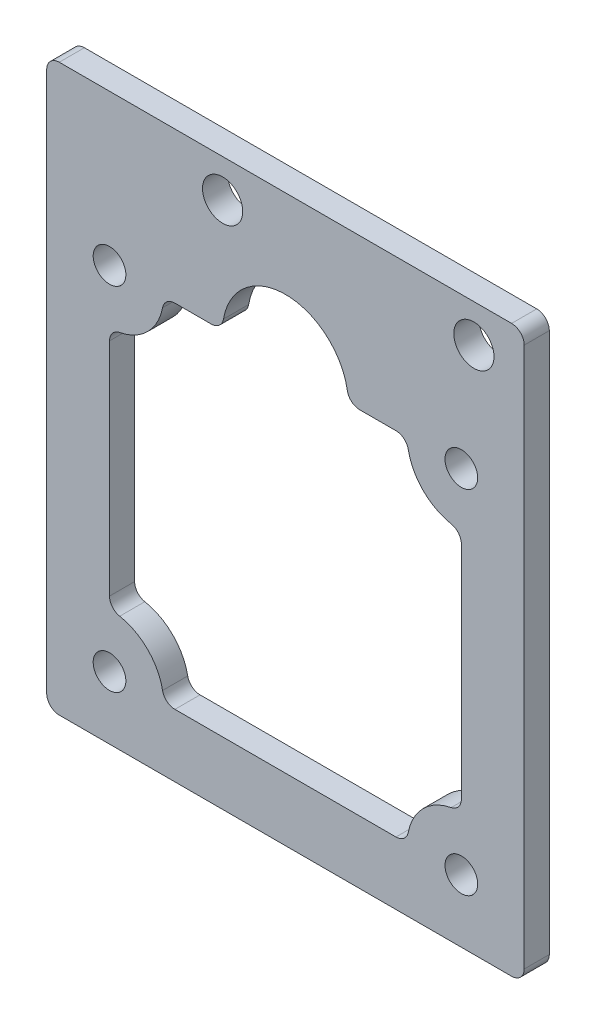
ISO-10303-21;
HEADER;
FILE_DESCRIPTION(('STEP AP214'),'2;1');
FILE_NAME('part.step','',(''),(''),'','','');
FILE_SCHEMA(('AUTOMOTIVE_DESIGN { 1 0 10303 214 1 1 1 1 }'));
ENDSEC;
DATA;
#1=APPLICATION_CONTEXT('core data for automotive mechanical design processes');
#2=APPLICATION_PROTOCOL_DEFINITION('international standard','automotive_design',2000,#1);
#3=PRODUCT_CONTEXT('',#1,'mechanical');
#4=PRODUCT('Part','Part','',(#3));
#5=PRODUCT_RELATED_PRODUCT_CATEGORY('part','',(#4));
#6=PRODUCT_DEFINITION_FORMATION('','',#4);
#7=PRODUCT_DEFINITION_CONTEXT('part definition',#1,'design');
#8=PRODUCT_DEFINITION('design','',#6,#7);
#9=PRODUCT_DEFINITION_SHAPE('','',#8);
#10=(LENGTH_UNIT() NAMED_UNIT(*) SI_UNIT(.MILLI.,.METRE.));
#11=(NAMED_UNIT(*) PLANE_ANGLE_UNIT() SI_UNIT($,.RADIAN.));
#12=(NAMED_UNIT(*) SI_UNIT($,.STERADIAN.) SOLID_ANGLE_UNIT());
#13=UNCERTAINTY_MEASURE_WITH_UNIT(LENGTH_MEASURE(1.E-05),#10,'distance_accuracy_value','');
#14=(GEOMETRIC_REPRESENTATION_CONTEXT(3) GLOBAL_UNCERTAINTY_ASSIGNED_CONTEXT((#13)) GLOBAL_UNIT_ASSIGNED_CONTEXT((#10,
#11,#12)) REPRESENTATION_CONTEXT('',''));
#15=CARTESIAN_POINT('',(0.,0.,0.));
#16=DIRECTION('',(0.,0.,1.));
#17=DIRECTION('',(1.,0.,0.));
#18=AXIS2_PLACEMENT_3D('',#15,#16,#17);
#19=CARTESIAN_POINT('',(0.,14.,2.));
#20=DIRECTION('',(0.,1.,0.));
#21=DIRECTION('',(0.,0.,1.));
#22=AXIS2_PLACEMENT_3D('',#19,#20,#21);
#23=PLANE('',#22);
#24=DIRECTION('',(1.,0.,0.));
#25=VECTOR('',#24,1.);
#26=CARTESIAN_POINT('',(0.,14.,2.));
#27=LINE('',#26,#25);
#28=CARTESIAN_POINT('',(-8.79519452813076,14.,2.));
#29=VERTEX_POINT('',#28);
#30=CARTESIAN_POINT('',(-5.91607978309962,14.,2.));
#31=VERTEX_POINT('',#30);
#32=EDGE_CURVE('E389',#29,#31,#27,.T.);
#33=ORIENTED_EDGE('',*,*,#32,.F.);
#34=DIRECTION('',(0.,0.,1.));
#35=VECTOR('',#34,1.);
#36=CARTESIAN_POINT('',(-8.79519452813076,14.,0.));
#37=LINE('',#36,#35);
#38=CARTESIAN_POINT('',(-8.79519452813076,14.,0.));
#39=VERTEX_POINT('',#38);
#40=EDGE_CURVE('E328',#29,#39,#37,.F.);
#41=ORIENTED_EDGE('',*,*,#40,.T.);
#42=DIRECTION('',(1.,0.,0.));
#43=VECTOR('',#42,1.);
#44=CARTESIAN_POINT('',(0.,14.,0.));
#45=LINE('',#44,#43);
#46=CARTESIAN_POINT('',(-5.91607978309962,14.,0.));
#47=VERTEX_POINT('',#46);
#48=EDGE_CURVE('E370',#39,#47,#45,.T.);
#49=ORIENTED_EDGE('',*,*,#48,.T.);
#50=DIRECTION('',(0.,0.,1.));
#51=VECTOR('',#50,1.);
#52=CARTESIAN_POINT('',(-5.91607978309962,14.,2.));
#53=LINE('',#52,#51);
#54=EDGE_CURVE('E325',#47,#31,#53,.T.);
#55=ORIENTED_EDGE('',*,*,#54,.T.);
#56=EDGE_LOOP('',(#33,#41,#49,#55));
#57=FACE_BOUND('',#56,.T.);
#58=ADVANCED_FACE('F37',(#57),#23,.F.);
#59=CARTESIAN_POINT('',(19.,0.,2.));
#60=DIRECTION('',(1.,0.,0.));
#61=DIRECTION('',(0.,1.,0.));
#62=AXIS2_PLACEMENT_3D('',#59,#60,#61);
#63=PLANE('',#62);
#64=DIRECTION('',(0.,-1.,0.));
#65=VECTOR('',#64,1.);
#66=CARTESIAN_POINT('',(19.,0.,0.));
#67=LINE('',#66,#65);
#68=CARTESIAN_POINT('',(19.,25.,0.));
#69=VERTEX_POINT('',#68);
#70=CARTESIAN_POINT('',(19.,-18.,0.));
#71=VERTEX_POINT('',#70);
#72=EDGE_CURVE('E226',#69,#71,#67,.T.);
#73=ORIENTED_EDGE('',*,*,#72,.F.);
#74=DIRECTION('',(0.,0.,1.));
#75=VECTOR('',#74,1.);
#76=CARTESIAN_POINT('',(19.,25.,2.));
#77=LINE('',#76,#75);
#78=CARTESIAN_POINT('',(19.,25.,2.));
#79=VERTEX_POINT('',#78);
#80=EDGE_CURVE('E239',#69,#79,#77,.T.);
#81=ORIENTED_EDGE('',*,*,#80,.T.);
#82=DIRECTION('',(0.,-1.,0.));
#83=VECTOR('',#82,1.);
#84=CARTESIAN_POINT('',(19.,0.,2.));
#85=LINE('',#84,#83);
#86=CARTESIAN_POINT('',(19.,-18.,2.));
#87=VERTEX_POINT('',#86);
#88=EDGE_CURVE('E426',#79,#87,#85,.T.);
#89=ORIENTED_EDGE('',*,*,#88,.T.);
#90=DIRECTION('',(0.,0.,-1.));
#91=VECTOR('',#90,1.);
#92=CARTESIAN_POINT('',(19.,-18.,0.));
#93=LINE('',#92,#91);
#94=EDGE_CURVE('E242',#87,#71,#93,.T.);
#95=ORIENTED_EDGE('',*,*,#94,.T.);
#96=EDGE_LOOP('',(#73,#81,#89,#95));
#97=FACE_BOUND('',#96,.T.);
#98=ADVANCED_FACE('F237',(#97),#63,.T.);
#99=CARTESIAN_POINT('',(-19.,0.,2.));
#100=DIRECTION('',(1.,0.,0.));
#101=DIRECTION('',(0.,0.,-1.));
#102=AXIS2_PLACEMENT_3D('',#99,#100,#101);
#103=PLANE('',#102);
#104=DIRECTION('',(0.,-1.,0.));
#105=VECTOR('',#104,1.);
#106=CARTESIAN_POINT('',(-19.,0.,0.));
#107=LINE('',#106,#105);
#108=CARTESIAN_POINT('',(-19.,25.,0.));
#109=VERTEX_POINT('',#108);
#110=CARTESIAN_POINT('',(-19.,-18.,0.));
#111=VERTEX_POINT('',#110);
#112=EDGE_CURVE('E243',#109,#111,#107,.T.);
#113=ORIENTED_EDGE('',*,*,#112,.T.);
#114=DIRECTION('',(0.,0.,-1.));
#115=VECTOR('',#114,1.);
#116=CARTESIAN_POINT('',(-19.,-18.,2.));
#117=LINE('',#116,#115);
#118=CARTESIAN_POINT('',(-19.,-18.,2.));
#119=VERTEX_POINT('',#118);
#120=EDGE_CURVE('E283',#111,#119,#117,.F.);
#121=ORIENTED_EDGE('',*,*,#120,.T.);
#122=DIRECTION('',(0.,-1.,0.));
#123=VECTOR('',#122,1.);
#124=CARTESIAN_POINT('',(-19.,0.,2.));
#125=LINE('',#124,#123);
#126=CARTESIAN_POINT('',(-19.,25.,2.));
#127=VERTEX_POINT('',#126);
#128=EDGE_CURVE('E428',#127,#119,#125,.T.);
#129=ORIENTED_EDGE('',*,*,#128,.F.);
#130=DIRECTION('',(0.,0.,1.));
#131=VECTOR('',#130,1.);
#132=CARTESIAN_POINT('',(-19.,25.,0.));
#133=LINE('',#132,#131);
#134=EDGE_CURVE('E59',#127,#109,#133,.F.);
#135=ORIENTED_EDGE('',*,*,#134,.T.);
#136=EDGE_LOOP('',(#113,#121,#129,#135));
#137=FACE_BOUND('',#136,.T.);
#138=ADVANCED_FACE('F580',(#137),#103,.F.);
#139=CARTESIAN_POINT('',(-14.,14.,2.));
#140=DIRECTION('',(0.,0.,-1.));
#141=DIRECTION('',(-1.,0.,0.));
#142=AXIS2_PLACEMENT_3D('',#139,#140,#141);
#143=CYLINDRICAL_SURFACE('',#142,4.3);
#144=CARTESIAN_POINT('',(-14.,14.,2.));
#145=DIRECTION('',(0.,0.,1.));
#146=DIRECTION('',(1.,0.,0.));
#147=AXIS2_PLACEMENT_3D('',#144,#145,#146);
#148=CIRCLE('',#147,4.3);
#149=CARTESIAN_POINT('',(-13.188679245283,9.77723329640797,2.));
#150=VERTEX_POINT('',#149);
#151=CARTESIAN_POINT('',(-9.77723329640797,13.188679245283,2.));
#152=VERTEX_POINT('',#151);
#153=EDGE_CURVE('E390',#150,#152,#148,.T.);
#154=ORIENTED_EDGE('',*,*,#153,.F.);
#155=DIRECTION('',(0.,0.,-1.));
#156=VECTOR('',#155,1.);
#157=CARTESIAN_POINT('',(-13.188679245283,9.77723329640797,2.));
#158=LINE('',#157,#156);
#159=CARTESIAN_POINT('',(-13.188679245283,9.77723329640797,0.));
#160=VERTEX_POINT('',#159);
#161=EDGE_CURVE('E322',#150,#160,#158,.T.);
#162=ORIENTED_EDGE('',*,*,#161,.T.);
#163=CARTESIAN_POINT('',(-14.,14.,0.));
#164=DIRECTION('',(0.,0.,1.));
#165=DIRECTION('',(1.,0.,0.));
#166=AXIS2_PLACEMENT_3D('',#163,#164,#165);
#167=CIRCLE('',#166,4.3);
#168=CARTESIAN_POINT('',(-9.77723329640797,13.188679245283,0.));
#169=VERTEX_POINT('',#168);
#170=EDGE_CURVE('E368',#160,#169,#167,.T.);
#171=ORIENTED_EDGE('',*,*,#170,.T.);
#172=DIRECTION('',(0.,0.,-1.));
#173=VECTOR('',#172,1.);
#174=CARTESIAN_POINT('',(-9.77723329640797,13.188679245283,2.));
#175=LINE('',#174,#173);
#176=EDGE_CURVE('E320',#169,#152,#175,.F.);
#177=ORIENTED_EDGE('',*,*,#176,.T.);
#178=EDGE_LOOP('',(#154,#162,#171,#177));
#179=FACE_BOUND('',#178,.T.);
#180=ADVANCED_FACE('F376',(#179),#143,.T.);
#181=CARTESIAN_POINT('',(5.91607978309962,14.,0.));
#182=VERTEX_POINT('',#181);
#183=CARTESIAN_POINT('',(8.79519452813075,14.,0.));
#184=VERTEX_POINT('',#183);
#185=EDGE_CURVE('E379',#182,#184,#45,.T.);
#186=ORIENTED_EDGE('',*,*,#185,.T.);
#187=DIRECTION('',(0.,0.,1.));
#188=VECTOR('',#187,1.);
#189=CARTESIAN_POINT('',(8.79519452813075,14.,2.));
#190=LINE('',#189,#188);
#191=CARTESIAN_POINT('',(8.79519452813075,14.,2.));
#192=VERTEX_POINT('',#191);
#193=EDGE_CURVE('E293',#184,#192,#190,.T.);
#194=ORIENTED_EDGE('',*,*,#193,.T.);
#195=CARTESIAN_POINT('',(5.91607978309962,14.,2.));
#196=VERTEX_POINT('',#195);
#197=EDGE_CURVE('E394',#196,#192,#27,.T.);
#198=ORIENTED_EDGE('',*,*,#197,.F.);
#199=DIRECTION('',(0.,0.,1.));
#200=VECTOR('',#199,1.);
#201=CARTESIAN_POINT('',(5.91607978309962,14.,2.));
#202=LINE('',#201,#200);
#203=EDGE_CURVE('E290',#196,#182,#202,.F.);
#204=ORIENTED_EDGE('',*,*,#203,.T.);
#205=EDGE_LOOP('',(#186,#194,#198,#204));
#206=FACE_BOUND('',#205,.T.);
#207=ADVANCED_FACE('F509',(#206),#23,.F.);
#208=CARTESIAN_POINT('',(14.,14.,2.));
#209=DIRECTION('',(0.,0.,-1.));
#210=DIRECTION('',(-1.,0.,0.));
#211=AXIS2_PLACEMENT_3D('',#208,#209,#210);
#212=CYLINDRICAL_SURFACE('',#211,4.3);
#213=CARTESIAN_POINT('',(14.,14.,2.));
#214=DIRECTION('',(0.,0.,1.));
#215=DIRECTION('',(1.,0.,0.));
#216=AXIS2_PLACEMENT_3D('',#213,#214,#215);
#217=CIRCLE('',#216,4.3);
#218=CARTESIAN_POINT('',(9.77723329640797,13.188679245283,2.));
#219=VERTEX_POINT('',#218);
#220=CARTESIAN_POINT('',(13.188679245283,9.77723329640797,2.));
#221=VERTEX_POINT('',#220);
#222=EDGE_CURVE('E393',#219,#221,#217,.T.);
#223=ORIENTED_EDGE('',*,*,#222,.F.);
#224=DIRECTION('',(0.,0.,-1.));
#225=VECTOR('',#224,1.);
#226=CARTESIAN_POINT('',(9.77723329640797,13.188679245283,2.));
#227=LINE('',#226,#225);
#228=CARTESIAN_POINT('',(9.77723329640797,13.188679245283,0.));
#229=VERTEX_POINT('',#228);
#230=EDGE_CURVE('E287',#219,#229,#227,.T.);
#231=ORIENTED_EDGE('',*,*,#230,.T.);
#232=CARTESIAN_POINT('',(14.,14.,0.));
#233=DIRECTION('',(0.,0.,1.));
#234=DIRECTION('',(1.,0.,0.));
#235=AXIS2_PLACEMENT_3D('',#232,#233,#234);
#236=CIRCLE('',#235,4.3);
#237=CARTESIAN_POINT('',(13.188679245283,9.77723329640797,0.));
#238=VERTEX_POINT('',#237);
#239=EDGE_CURVE('E437',#229,#238,#236,.T.);
#240=ORIENTED_EDGE('',*,*,#239,.T.);
#241=DIRECTION('',(0.,0.,-1.));
#242=VECTOR('',#241,1.);
#243=CARTESIAN_POINT('',(13.188679245283,9.77723329640797,2.));
#244=LINE('',#243,#242);
#245=EDGE_CURVE('E285',#238,#221,#244,.F.);
#246=ORIENTED_EDGE('',*,*,#245,.T.);
#247=EDGE_LOOP('',(#223,#231,#240,#246));
#248=FACE_BOUND('',#247,.T.);
#249=ADVANCED_FACE('F517',(#248),#212,.T.);
#250=CARTESIAN_POINT('',(14.,0.,2.));
#251=DIRECTION('',(1.,0.,0.));
#252=DIRECTION('',(0.,0.,-1.));
#253=AXIS2_PLACEMENT_3D('',#250,#251,#252);
#254=PLANE('',#253);
#255=DIRECTION('',(0.,-1.,0.));
#256=VECTOR('',#255,1.);
#257=CARTESIAN_POINT('',(14.,0.,2.));
#258=LINE('',#257,#256);
#259=CARTESIAN_POINT('',(14.,8.79519452813076,2.));
#260=VERTEX_POINT('',#259);
#261=CARTESIAN_POINT('',(14.,-8.79519452813075,2.));
#262=VERTEX_POINT('',#261);
#263=EDGE_CURVE('E397',#260,#262,#258,.T.);
#264=ORIENTED_EDGE('',*,*,#263,.F.);
#265=DIRECTION('',(0.,0.,1.));
#266=VECTOR('',#265,1.);
#267=CARTESIAN_POINT('',(14.,8.79519452813076,0.));
#268=LINE('',#267,#266);
#269=CARTESIAN_POINT('',(14.,8.79519452813076,0.));
#270=VERTEX_POINT('',#269);
#271=EDGE_CURVE('E297',#260,#270,#268,.F.);
#272=ORIENTED_EDGE('',*,*,#271,.T.);
#273=DIRECTION('',(0.,-1.,0.));
#274=VECTOR('',#273,1.);
#275=CARTESIAN_POINT('',(14.,0.,0.));
#276=LINE('',#275,#274);
#277=CARTESIAN_POINT('',(14.,-8.79519452813075,0.));
#278=VERTEX_POINT('',#277);
#279=EDGE_CURVE('E440',#270,#278,#276,.T.);
#280=ORIENTED_EDGE('',*,*,#279,.T.);
#281=DIRECTION('',(0.,0.,1.));
#282=VECTOR('',#281,1.);
#283=CARTESIAN_POINT('',(14.,-8.79519452813075,2.));
#284=LINE('',#283,#282);
#285=EDGE_CURVE('E295',#278,#262,#284,.T.);
#286=ORIENTED_EDGE('',*,*,#285,.T.);
#287=EDGE_LOOP('',(#264,#272,#280,#286));
#288=FACE_BOUND('',#287,.T.);
#289=ADVANCED_FACE('F526',(#288),#254,.F.);
#290=CARTESIAN_POINT('',(14.,-14.,2.));
#291=DIRECTION('',(0.,0.,-1.));
#292=DIRECTION('',(-1.,0.,0.));
#293=AXIS2_PLACEMENT_3D('',#290,#291,#292);
#294=CYLINDRICAL_SURFACE('',#293,4.3);
#295=CARTESIAN_POINT('',(14.,-14.,2.));
#296=DIRECTION('',(0.,0.,1.));
#297=DIRECTION('',(1.,0.,0.));
#298=AXIS2_PLACEMENT_3D('',#295,#296,#297);
#299=CIRCLE('',#298,4.3);
#300=CARTESIAN_POINT('',(13.188679245283,-9.77723329640797,2.));
#301=VERTEX_POINT('',#300);
#302=CARTESIAN_POINT('',(9.77723329640797,-13.188679245283,2.));
#303=VERTEX_POINT('',#302);
#304=EDGE_CURVE('E405',#301,#303,#299,.T.);
#305=ORIENTED_EDGE('',*,*,#304,.F.);
#306=DIRECTION('',(0.,0.,-1.));
#307=VECTOR('',#306,1.);
#308=CARTESIAN_POINT('',(13.188679245283,-9.77723329640797,2.));
#309=LINE('',#308,#307);
#310=CARTESIAN_POINT('',(13.188679245283,-9.77723329640797,0.));
#311=VERTEX_POINT('',#310);
#312=EDGE_CURVE('E302',#301,#311,#309,.T.);
#313=ORIENTED_EDGE('',*,*,#312,.T.);
#314=CARTESIAN_POINT('',(14.,-14.,0.));
#315=DIRECTION('',(0.,0.,1.));
#316=DIRECTION('',(1.,0.,0.));
#317=AXIS2_PLACEMENT_3D('',#314,#315,#316);
#318=CIRCLE('',#317,4.3);
#319=CARTESIAN_POINT('',(9.77723329640797,-13.188679245283,0.));
#320=VERTEX_POINT('',#319);
#321=EDGE_CURVE('E443',#311,#320,#318,.T.);
#322=ORIENTED_EDGE('',*,*,#321,.T.);
#323=DIRECTION('',(0.,0.,-1.));
#324=VECTOR('',#323,1.);
#325=CARTESIAN_POINT('',(9.77723329640797,-13.188679245283,2.));
#326=LINE('',#325,#324);
#327=EDGE_CURVE('E300',#320,#303,#326,.F.);
#328=ORIENTED_EDGE('',*,*,#327,.T.);
#329=EDGE_LOOP('',(#305,#313,#322,#328));
#330=FACE_BOUND('',#329,.T.);
#331=ADVANCED_FACE('F535',(#330),#294,.T.);
#332=CARTESIAN_POINT('',(0.,-14.,2.));
#333=DIRECTION('',(0.,1.,0.));
#334=DIRECTION('',(0.,0.,1.));
#335=AXIS2_PLACEMENT_3D('',#332,#333,#334);
#336=PLANE('',#335);
#337=DIRECTION('',(1.,0.,0.));
#338=VECTOR('',#337,1.);
#339=CARTESIAN_POINT('',(0.,-14.,2.));
#340=LINE('',#339,#338);
#341=CARTESIAN_POINT('',(-8.79519452813076,-14.,2.));
#342=VERTEX_POINT('',#341);
#343=CARTESIAN_POINT('',(8.79519452813075,-14.,2.));
#344=VERTEX_POINT('',#343);
#345=EDGE_CURVE('E408',#342,#344,#340,.T.);
#346=ORIENTED_EDGE('',*,*,#345,.T.);
#347=DIRECTION('',(0.,0.,-1.));
#348=VECTOR('',#347,1.);
#349=CARTESIAN_POINT('',(8.79519452813075,-14.,2.));
#350=LINE('',#349,#348);
#351=CARTESIAN_POINT('',(8.79519452813075,-14.,0.));
#352=VERTEX_POINT('',#351);
#353=EDGE_CURVE('E307',#344,#352,#350,.T.);
#354=ORIENTED_EDGE('',*,*,#353,.T.);
#355=DIRECTION('',(1.,0.,0.));
#356=VECTOR('',#355,1.);
#357=CARTESIAN_POINT('',(0.,-14.,0.));
#358=LINE('',#357,#356);
#359=CARTESIAN_POINT('',(-8.79519452813076,-14.,0.));
#360=VERTEX_POINT('',#359);
#361=EDGE_CURVE('E446',#360,#352,#358,.T.);
#362=ORIENTED_EDGE('',*,*,#361,.F.);
#363=DIRECTION('',(0.,0.,-1.));
#364=VECTOR('',#363,1.);
#365=CARTESIAN_POINT('',(-8.79519452813076,-14.,2.));
#366=LINE('',#365,#364);
#367=EDGE_CURVE('E305',#360,#342,#366,.F.);
#368=ORIENTED_EDGE('',*,*,#367,.T.);
#369=EDGE_LOOP('',(#346,#354,#362,#368));
#370=FACE_BOUND('',#369,.T.);
#371=ADVANCED_FACE('F544',(#370),#336,.T.);
#372=CARTESIAN_POINT('',(-14.,-14.,2.));
#373=DIRECTION('',(0.,0.,-1.));
#374=DIRECTION('',(-1.,0.,0.));
#375=AXIS2_PLACEMENT_3D('',#372,#373,#374);
#376=CYLINDRICAL_SURFACE('',#375,4.3);
#377=CARTESIAN_POINT('',(-14.,-14.,2.));
#378=DIRECTION('',(0.,0.,1.));
#379=DIRECTION('',(1.,0.,0.));
#380=AXIS2_PLACEMENT_3D('',#377,#378,#379);
#381=CIRCLE('',#380,4.3);
#382=CARTESIAN_POINT('',(-9.77723329640797,-13.188679245283,2.));
#383=VERTEX_POINT('',#382);
#384=CARTESIAN_POINT('',(-13.188679245283,-9.77723329640797,2.));
#385=VERTEX_POINT('',#384);
#386=EDGE_CURVE('E411',#383,#385,#381,.T.);
#387=ORIENTED_EDGE('',*,*,#386,.F.);
#388=DIRECTION('',(0.,0.,-1.));
#389=VECTOR('',#388,1.);
#390=CARTESIAN_POINT('',(-9.77723329640797,-13.188679245283,2.));
#391=LINE('',#390,#389);
#392=CARTESIAN_POINT('',(-9.77723329640797,-13.188679245283,0.));
#393=VERTEX_POINT('',#392);
#394=EDGE_CURVE('E312',#383,#393,#391,.T.);
#395=ORIENTED_EDGE('',*,*,#394,.T.);
#396=CARTESIAN_POINT('',(-14.,-14.,0.));
#397=DIRECTION('',(0.,0.,1.));
#398=DIRECTION('',(1.,0.,0.));
#399=AXIS2_PLACEMENT_3D('',#396,#397,#398);
#400=CIRCLE('',#399,4.3);
#401=CARTESIAN_POINT('',(-13.188679245283,-9.77723329640797,0.));
#402=VERTEX_POINT('',#401);
#403=EDGE_CURVE('E449',#393,#402,#400,.T.);
#404=ORIENTED_EDGE('',*,*,#403,.T.);
#405=DIRECTION('',(0.,0.,-1.));
#406=VECTOR('',#405,1.);
#407=CARTESIAN_POINT('',(-13.188679245283,-9.77723329640797,2.));
#408=LINE('',#407,#406);
#409=EDGE_CURVE('E310',#402,#385,#408,.F.);
#410=ORIENTED_EDGE('',*,*,#409,.T.);
#411=EDGE_LOOP('',(#387,#395,#404,#410));
#412=FACE_BOUND('',#411,.T.);
#413=ADVANCED_FACE('F553',(#412),#376,.T.);
#414=CARTESIAN_POINT('',(14.,14.,2.));
#415=DIRECTION('',(0.,0.,-1.));
#416=DIRECTION('',(-1.,0.,0.));
#417=AXIS2_PLACEMENT_3D('',#414,#415,#416);
#418=CYLINDRICAL_SURFACE('',#417,1.3);
#419=CARTESIAN_POINT('',(14.,14.,2.));
#420=DIRECTION('',(0.,0.,1.));
#421=DIRECTION('',(1.,0.,0.));
#422=AXIS2_PLACEMENT_3D('',#419,#420,#421);
#423=CIRCLE('',#422,1.3);
#424=CARTESIAN_POINT('',(15.3,14.,2.));
#425=VERTEX_POINT('',#424);
#426=EDGE_CURVE('E423',#425,#425,#423,.T.);
#427=ORIENTED_EDGE('',*,*,#426,.T.);
#428=EDGE_LOOP('',(#427));
#429=FACE_BOUND('',#428,.T.);
#430=CARTESIAN_POINT('',(14.,14.,0.));
#431=DIRECTION('',(0.,0.,1.));
#432=DIRECTION('',(1.,0.,0.));
#433=AXIS2_PLACEMENT_3D('',#430,#431,#432);
#434=CIRCLE('',#433,1.3);
#435=CARTESIAN_POINT('',(15.3,14.,0.));
#436=VERTEX_POINT('',#435);
#437=EDGE_CURVE('E244',#436,#436,#434,.T.);
#438=ORIENTED_EDGE('',*,*,#437,.F.);
#439=EDGE_LOOP('',(#438));
#440=FACE_BOUND('',#439,.T.);
#441=ADVANCED_FACE('F682',(#429,#440),#418,.F.);
#442=CARTESIAN_POINT('',(14.,-14.,2.));
#443=DIRECTION('',(0.,0.,-1.));
#444=DIRECTION('',(-1.,0.,0.));
#445=AXIS2_PLACEMENT_3D('',#442,#443,#444);
#446=CYLINDRICAL_SURFACE('',#445,1.3);
#447=CARTESIAN_POINT('',(14.,-14.,2.));
#448=DIRECTION('',(0.,0.,1.));
#449=DIRECTION('',(1.,0.,0.));
#450=AXIS2_PLACEMENT_3D('',#447,#448,#449);
#451=CIRCLE('',#450,1.3);
#452=CARTESIAN_POINT('',(15.3,-14.,2.));
#453=VERTEX_POINT('',#452);
#454=EDGE_CURVE('E420',#453,#453,#451,.T.);
#455=ORIENTED_EDGE('',*,*,#454,.T.);
#456=EDGE_LOOP('',(#455));
#457=FACE_BOUND('',#456,.T.);
#458=CARTESIAN_POINT('',(14.,-14.,0.));
#459=DIRECTION('',(0.,0.,1.));
#460=DIRECTION('',(1.,0.,0.));
#461=AXIS2_PLACEMENT_3D('',#458,#459,#460);
#462=CIRCLE('',#461,1.3);
#463=CARTESIAN_POINT('',(15.3,-14.,0.));
#464=VERTEX_POINT('',#463);
#465=EDGE_CURVE('E458',#464,#464,#462,.T.);
#466=ORIENTED_EDGE('',*,*,#465,.F.);
#467=EDGE_LOOP('',(#466));
#468=FACE_BOUND('',#467,.T.);
#469=ADVANCED_FACE('F685',(#457,#468),#446,.F.);
#470=CARTESIAN_POINT('',(-14.,14.,2.));
#471=DIRECTION('',(0.,0.,-1.));
#472=DIRECTION('',(-1.,0.,0.));
#473=AXIS2_PLACEMENT_3D('',#470,#471,#472);
#474=CYLINDRICAL_SURFACE('',#473,1.3);
#475=CARTESIAN_POINT('',(-14.,14.,2.));
#476=DIRECTION('',(0.,0.,1.));
#477=DIRECTION('',(1.,0.,0.));
#478=AXIS2_PLACEMENT_3D('',#475,#476,#477);
#479=CIRCLE('',#478,1.3);
#480=CARTESIAN_POINT('',(-12.7,14.,2.));
#481=VERTEX_POINT('',#480);
#482=EDGE_CURVE('E417',#481,#481,#479,.T.);
#483=ORIENTED_EDGE('',*,*,#482,.T.);
#484=EDGE_LOOP('',(#483));
#485=FACE_BOUND('',#484,.T.);
#486=CARTESIAN_POINT('',(-14.,14.,0.));
#487=DIRECTION('',(0.,0.,1.));
#488=DIRECTION('',(1.,0.,0.));
#489=AXIS2_PLACEMENT_3D('',#486,#487,#488);
#490=CIRCLE('',#489,1.3);
#491=CARTESIAN_POINT('',(-12.7,14.,0.));
#492=VERTEX_POINT('',#491);
#493=EDGE_CURVE('E455',#492,#492,#490,.T.);
#494=ORIENTED_EDGE('',*,*,#493,.F.);
#495=EDGE_LOOP('',(#494));
#496=FACE_BOUND('',#495,.T.);
#497=ADVANCED_FACE('F689',(#485,#496),#474,.F.);
#498=CARTESIAN_POINT('',(-14.,0.,2.));
#499=DIRECTION('',(1.,0.,0.));
#500=DIRECTION('',(0.,0.,-1.));
#501=AXIS2_PLACEMENT_3D('',#498,#499,#500);
#502=PLANE('',#501);
#503=DIRECTION('',(0.,-1.,0.));
#504=VECTOR('',#503,1.);
#505=CARTESIAN_POINT('',(-14.,0.,2.));
#506=LINE('',#505,#504);
#507=CARTESIAN_POINT('',(-14.,8.79519452813076,2.));
#508=VERTEX_POINT('',#507);
#509=CARTESIAN_POINT('',(-14.,-8.79519452813075,2.));
#510=VERTEX_POINT('',#509);
#511=EDGE_CURVE('E414',#508,#510,#506,.T.);
#512=ORIENTED_EDGE('',*,*,#511,.T.);
#513=DIRECTION('',(0.,0.,-1.));
#514=VECTOR('',#513,1.);
#515=CARTESIAN_POINT('',(-14.,-8.79519452813075,2.));
#516=LINE('',#515,#514);
#517=CARTESIAN_POINT('',(-14.,-8.79519452813075,0.));
#518=VERTEX_POINT('',#517);
#519=EDGE_CURVE('E317',#510,#518,#516,.T.);
#520=ORIENTED_EDGE('',*,*,#519,.T.);
#521=DIRECTION('',(0.,-1.,0.));
#522=VECTOR('',#521,1.);
#523=CARTESIAN_POINT('',(-14.,0.,0.));
#524=LINE('',#523,#522);
#525=CARTESIAN_POINT('',(-14.,8.79519452813076,0.));
#526=VERTEX_POINT('',#525);
#527=EDGE_CURVE('E452',#526,#518,#524,.T.);
#528=ORIENTED_EDGE('',*,*,#527,.F.);
#529=DIRECTION('',(0.,0.,-1.));
#530=VECTOR('',#529,1.);
#531=CARTESIAN_POINT('',(-14.,8.79519452813076,2.));
#532=LINE('',#531,#530);
#533=EDGE_CURVE('E315',#526,#508,#532,.F.);
#534=ORIENTED_EDGE('',*,*,#533,.T.);
#535=EDGE_LOOP('',(#512,#520,#528,#534));
#536=FACE_BOUND('',#535,.T.);
#537=ADVANCED_FACE('F562',(#536),#502,.T.);
#538=CARTESIAN_POINT('',(-14.,-14.,2.));
#539=DIRECTION('',(0.,0.,-1.));
#540=DIRECTION('',(-1.,0.,0.));
#541=AXIS2_PLACEMENT_3D('',#538,#539,#540);
#542=CYLINDRICAL_SURFACE('',#541,1.3);
#543=CARTESIAN_POINT('',(-14.,-14.,2.));
#544=DIRECTION('',(0.,0.,1.));
#545=DIRECTION('',(1.,0.,0.));
#546=AXIS2_PLACEMENT_3D('',#543,#544,#545);
#547=CIRCLE('',#546,1.3);
#548=CARTESIAN_POINT('',(-12.7,-14.,2.));
#549=VERTEX_POINT('',#548);
#550=EDGE_CURVE('E465',#549,#549,#547,.T.);
#551=ORIENTED_EDGE('',*,*,#550,.T.);
#552=EDGE_LOOP('',(#551));
#553=FACE_BOUND('',#552,.T.);
#554=CARTESIAN_POINT('',(-14.,-14.,0.));
#555=DIRECTION('',(0.,0.,1.));
#556=DIRECTION('',(1.,0.,0.));
#557=AXIS2_PLACEMENT_3D('',#554,#555,#556);
#558=CIRCLE('',#557,1.3);
#559=CARTESIAN_POINT('',(-12.7,-14.,0.));
#560=VERTEX_POINT('',#559);
#561=EDGE_CURVE('E380',#560,#560,#558,.T.);
#562=ORIENTED_EDGE('',*,*,#561,.F.);
#563=EDGE_LOOP('',(#562));
#564=FACE_BOUND('',#563,.T.);
#565=ADVANCED_FACE('F594',(#553,#564),#542,.F.);
#566=CARTESIAN_POINT('',(0.,-19.,2.));
#567=DIRECTION('',(0.,1.,0.));
#568=DIRECTION('',(0.,0.,1.));
#569=AXIS2_PLACEMENT_3D('',#566,#567,#568);
#570=PLANE('',#569);
#571=DIRECTION('',(1.,0.,0.));
#572=VECTOR('',#571,1.);
#573=CARTESIAN_POINT('',(0.,-19.,2.));
#574=LINE('',#573,#572);
#575=CARTESIAN_POINT('',(-18.,-19.,2.));
#576=VERTEX_POINT('',#575);
#577=CARTESIAN_POINT('',(18.,-19.,2.));
#578=VERTEX_POINT('',#577);
#579=EDGE_CURVE('E252',#576,#578,#574,.T.);
#580=ORIENTED_EDGE('',*,*,#579,.F.);
#581=DIRECTION('',(0.,0.,-1.));
#582=VECTOR('',#581,1.);
#583=CARTESIAN_POINT('',(-18.,-19.,2.));
#584=LINE('',#583,#582);
#585=CARTESIAN_POINT('',(-18.,-19.,0.));
#586=VERTEX_POINT('',#585);
#587=EDGE_CURVE('E279',#576,#586,#584,.T.);
#588=ORIENTED_EDGE('',*,*,#587,.T.);
#589=DIRECTION('',(1.,0.,0.));
#590=VECTOR('',#589,1.);
#591=CARTESIAN_POINT('',(0.,-19.,0.));
#592=LINE('',#591,#590);
#593=CARTESIAN_POINT('',(18.,-19.,0.));
#594=VERTEX_POINT('',#593);
#595=EDGE_CURVE('E463',#586,#594,#592,.T.);
#596=ORIENTED_EDGE('',*,*,#595,.T.);
#597=DIRECTION('',(0.,0.,-1.));
#598=VECTOR('',#597,1.);
#599=CARTESIAN_POINT('',(18.,-19.,2.));
#600=LINE('',#599,#598);
#601=EDGE_CURVE('E232',#594,#578,#600,.F.);
#602=ORIENTED_EDGE('',*,*,#601,.T.);
#603=EDGE_LOOP('',(#580,#588,#596,#602));
#604=FACE_BOUND('',#603,.T.);
#605=ADVANCED_FACE('F597',(#604),#570,.F.);
#606=CARTESIAN_POINT('',(0.,0.,2.));
#607=DIRECTION('',(0.,0.,1.));
#608=DIRECTION('',(1.,0.,0.));
#609=AXIS2_PLACEMENT_3D('',#606,#607,#608);
#610=PLANE('',#609);
#611=ORIENTED_EDGE('',*,*,#32,.T.);
#612=CARTESIAN_POINT('',(-5.91607978309962,15.,2.));
#613=DIRECTION('',(0.,0.,1.));
#614=DIRECTION('',(1.,0.,0.));
#615=AXIS2_PLACEMENT_3D('',#612,#613,#614);
#616=CIRCLE('',#615,1.);
#617=CARTESIAN_POINT('',(-4.93006648591635,14.8333333333333,2.));
#618=VERTEX_POINT('',#617);
#619=EDGE_CURVE('E257',#31,#618,#616,.T.);
#620=ORIENTED_EDGE('',*,*,#619,.T.);
#621=CARTESIAN_POINT('',(0.,14.,2.));
#622=DIRECTION('',(0.,0.,1.));
#623=DIRECTION('',(1.,0.,0.));
#624=AXIS2_PLACEMENT_3D('',#621,#622,#623);
#625=CIRCLE('',#624,5.);
#626=CARTESIAN_POINT('',(4.93006648591635,14.8333333333333,2.));
#627=VERTEX_POINT('',#626);
#628=EDGE_CURVE('E488',#627,#618,#625,.T.);
#629=ORIENTED_EDGE('',*,*,#628,.F.);
#630=CARTESIAN_POINT('',(5.91607978309962,15.,2.));
#631=DIRECTION('',(0.,0.,1.));
#632=DIRECTION('',(1.,0.,0.));
#633=AXIS2_PLACEMENT_3D('',#630,#631,#632);
#634=CIRCLE('',#633,1.);
#635=EDGE_CURVE('E250',#627,#196,#634,.T.);
#636=ORIENTED_EDGE('',*,*,#635,.T.);
#637=ORIENTED_EDGE('',*,*,#197,.T.);
#638=CARTESIAN_POINT('',(8.79519452813075,13.,2.));
#639=DIRECTION('',(0.,0.,1.));
#640=DIRECTION('',(1.,0.,0.));
#641=AXIS2_PLACEMENT_3D('',#638,#639,#640);
#642=CIRCLE('',#641,1.);
#643=EDGE_CURVE('E337',#192,#219,#642,.F.);
#644=ORIENTED_EDGE('',*,*,#643,.T.);
#645=ORIENTED_EDGE('',*,*,#222,.T.);
#646=CARTESIAN_POINT('',(13.,8.79519452813076,2.));
#647=DIRECTION('',(0.,0.,1.));
#648=DIRECTION('',(1.,0.,0.));
#649=AXIS2_PLACEMENT_3D('',#646,#647,#648);
#650=CIRCLE('',#649,1.);
#651=EDGE_CURVE('E341',#221,#260,#650,.F.);
#652=ORIENTED_EDGE('',*,*,#651,.T.);
#653=ORIENTED_EDGE('',*,*,#263,.T.);
#654=CARTESIAN_POINT('',(13.,-8.79519452813075,2.));
#655=DIRECTION('',(0.,0.,1.));
#656=DIRECTION('',(1.,0.,0.));
#657=AXIS2_PLACEMENT_3D('',#654,#655,#656);
#658=CIRCLE('',#657,1.);
#659=EDGE_CURVE('E345',#262,#301,#658,.F.);
#660=ORIENTED_EDGE('',*,*,#659,.T.);
#661=ORIENTED_EDGE('',*,*,#304,.T.);
#662=CARTESIAN_POINT('',(8.79519452813075,-13.,2.));
#663=DIRECTION('',(0.,0.,1.));
#664=DIRECTION('',(1.,0.,0.));
#665=AXIS2_PLACEMENT_3D('',#662,#663,#664);
#666=CIRCLE('',#665,1.);
#667=EDGE_CURVE('E349',#303,#344,#666,.F.);
#668=ORIENTED_EDGE('',*,*,#667,.T.);
#669=ORIENTED_EDGE('',*,*,#345,.F.);
#670=CARTESIAN_POINT('',(-8.79519452813076,-13.,2.));
#671=DIRECTION('',(0.,0.,1.));
#672=DIRECTION('',(1.,0.,0.));
#673=AXIS2_PLACEMENT_3D('',#670,#671,#672);
#674=CIRCLE('',#673,1.);
#675=EDGE_CURVE('E353',#342,#383,#674,.F.);
#676=ORIENTED_EDGE('',*,*,#675,.T.);
#677=ORIENTED_EDGE('',*,*,#386,.T.);
#678=CARTESIAN_POINT('',(-13.,-8.79519452813075,2.));
#679=DIRECTION('',(0.,0.,1.));
#680=DIRECTION('',(1.,0.,0.));
#681=AXIS2_PLACEMENT_3D('',#678,#679,#680);
#682=CIRCLE('',#681,1.);
#683=EDGE_CURVE('E357',#385,#510,#682,.F.);
#684=ORIENTED_EDGE('',*,*,#683,.T.);
#685=ORIENTED_EDGE('',*,*,#511,.F.);
#686=CARTESIAN_POINT('',(-13.,8.79519452813076,2.));
#687=DIRECTION('',(0.,0.,1.));
#688=DIRECTION('',(1.,0.,0.));
#689=AXIS2_PLACEMENT_3D('',#686,#687,#688);
#690=CIRCLE('',#689,1.);
#691=EDGE_CURVE('E361',#508,#150,#690,.F.);
#692=ORIENTED_EDGE('',*,*,#691,.T.);
#693=ORIENTED_EDGE('',*,*,#153,.T.);
#694=CARTESIAN_POINT('',(-8.79519452813076,13.,2.));
#695=DIRECTION('',(0.,0.,1.));
#696=DIRECTION('',(1.,0.,0.));
#697=AXIS2_PLACEMENT_3D('',#694,#695,#696);
#698=CIRCLE('',#697,1.);
#699=EDGE_CURVE('E11',#152,#29,#698,.F.);
#700=ORIENTED_EDGE('',*,*,#699,.T.);
#701=EDGE_LOOP('',(#611,#620,#629,#636,#637,#644,#645,#652,#653,#660,#661,#668,#669,#676,#677,
#684,#685,#692,#693,#700));
#702=FACE_BOUND('',#701,.T.);
#703=ORIENTED_EDGE('',*,*,#550,.F.);
#704=EDGE_LOOP('',(#703));
#705=FACE_BOUND('',#704,.T.);
#706=ORIENTED_EDGE('',*,*,#482,.F.);
#707=EDGE_LOOP('',(#706));
#708=FACE_BOUND('',#707,.T.);
#709=ORIENTED_EDGE('',*,*,#454,.F.);
#710=EDGE_LOOP('',(#709));
#711=FACE_BOUND('',#710,.T.);
#712=ORIENTED_EDGE('',*,*,#426,.F.);
#713=EDGE_LOOP('',(#712));
#714=FACE_BOUND('',#713,.T.);
#715=ORIENTED_EDGE('',*,*,#88,.F.);
#716=CARTESIAN_POINT('',(18.,25.,2.));
#717=DIRECTION('',(0.,0.,1.));
#718=DIRECTION('',(1.,0.,0.));
#719=AXIS2_PLACEMENT_3D('',#716,#717,#718);
#720=CIRCLE('',#719,1.);
#721=CARTESIAN_POINT('',(18.,26.,2.));
#722=VERTEX_POINT('',#721);
#723=EDGE_CURVE('E247',#79,#722,#720,.T.);
#724=ORIENTED_EDGE('',*,*,#723,.T.);
#725=DIRECTION('',(-1.,0.,0.));
#726=VECTOR('',#725,1.);
#727=CARTESIAN_POINT('',(-19.,26.,2.));
#728=LINE('',#727,#726);
#729=CARTESIAN_POINT('',(-18.,26.,2.));
#730=VERTEX_POINT('',#729);
#731=EDGE_CURVE('E475',#722,#730,#728,.T.);
#732=ORIENTED_EDGE('',*,*,#731,.T.);
#733=CARTESIAN_POINT('',(-18.,25.,2.));
#734=DIRECTION('',(0.,0.,1.));
#735=DIRECTION('',(1.,0.,0.));
#736=AXIS2_PLACEMENT_3D('',#733,#734,#735);
#737=CIRCLE('',#736,1.);
#738=EDGE_CURVE('E248',#730,#127,#737,.T.);
#739=ORIENTED_EDGE('',*,*,#738,.T.);
#740=ORIENTED_EDGE('',*,*,#128,.T.);
#741=CARTESIAN_POINT('',(-18.,-18.,2.));
#742=DIRECTION('',(0.,0.,1.));
#743=DIRECTION('',(1.,0.,0.));
#744=AXIS2_PLACEMENT_3D('',#741,#742,#743);
#745=CIRCLE('',#744,1.);
#746=EDGE_CURVE('E261',#119,#576,#745,.T.);
#747=ORIENTED_EDGE('',*,*,#746,.T.);
#748=ORIENTED_EDGE('',*,*,#579,.T.);
#749=CARTESIAN_POINT('',(18.,-18.,2.));
#750=DIRECTION('',(0.,0.,1.));
#751=DIRECTION('',(1.,0.,0.));
#752=AXIS2_PLACEMENT_3D('',#749,#750,#751);
#753=CIRCLE('',#752,1.);
#754=EDGE_CURVE('E259',#578,#87,#753,.T.);
#755=ORIENTED_EDGE('',*,*,#754,.T.);
#756=EDGE_LOOP('',(#715,#724,#732,#739,#740,#747,#748,#755));
#757=FACE_BOUND('',#756,.T.);
#758=CARTESIAN_POINT('',(15.,23.,2.));
#759=DIRECTION('',(0.,0.,1.));
#760=DIRECTION('',(1.,0.,0.));
#761=AXIS2_PLACEMENT_3D('',#758,#759,#760);
#762=CIRCLE('',#761,1.6);
#763=CARTESIAN_POINT('',(16.6,23.,2.));
#764=VERTEX_POINT('',#763);
#765=EDGE_CURVE('E481',#764,#764,#762,.T.);
#766=ORIENTED_EDGE('',*,*,#765,.F.);
#767=EDGE_LOOP('',(#766));
#768=FACE_BOUND('',#767,.T.);
#769=CARTESIAN_POINT('',(-5.,23.,2.));
#770=DIRECTION('',(0.,0.,1.));
#771=DIRECTION('',(1.,0.,0.));
#772=AXIS2_PLACEMENT_3D('',#769,#770,#771);
#773=CIRCLE('',#772,1.6);
#774=CARTESIAN_POINT('',(-3.4,23.,2.));
#775=VERTEX_POINT('',#774);
#776=EDGE_CURVE('E478',#775,#775,#773,.T.);
#777=ORIENTED_EDGE('',*,*,#776,.F.);
#778=EDGE_LOOP('',(#777));
#779=FACE_BOUND('',#778,.T.);
#780=ADVANCED_FACE('F387',(#702,#705,#708,#711,#714,#757,#768,#779),#610,.T.);
#781=CARTESIAN_POINT('',(0.,0.,0.));
#782=DIRECTION('',(0.,0.,1.));
#783=DIRECTION('',(1.,0.,0.));
#784=AXIS2_PLACEMENT_3D('',#781,#782,#783);
#785=PLANE('',#784);
#786=ORIENTED_EDGE('',*,*,#561,.T.);
#787=EDGE_LOOP('',(#786));
#788=FACE_BOUND('',#787,.T.);
#789=CARTESIAN_POINT('',(0.,14.,0.));
#790=DIRECTION('',(0.,0.,1.));
#791=DIRECTION('',(1.,0.,0.));
#792=AXIS2_PLACEMENT_3D('',#789,#790,#791);
#793=CIRCLE('',#792,5.);
#794=CARTESIAN_POINT('',(4.93006648591635,14.8333333333333,0.));
#795=VERTEX_POINT('',#794);
#796=CARTESIAN_POINT('',(-4.93006648591635,14.8333333333333,0.));
#797=VERTEX_POINT('',#796);
#798=EDGE_CURVE('E484',#795,#797,#793,.T.);
#799=ORIENTED_EDGE('',*,*,#798,.T.);
#800=CARTESIAN_POINT('',(-5.91607978309962,15.,0.));
#801=DIRECTION('',(0.,0.,1.));
#802=DIRECTION('',(1.,0.,0.));
#803=AXIS2_PLACEMENT_3D('',#800,#801,#802);
#804=CIRCLE('',#803,1.);
#805=EDGE_CURVE('E273',#797,#47,#804,.F.);
#806=ORIENTED_EDGE('',*,*,#805,.T.);
#807=ORIENTED_EDGE('',*,*,#48,.F.);
#808=CARTESIAN_POINT('',(-8.79519452813076,13.,0.));
#809=DIRECTION('',(0.,0.,1.));
#810=DIRECTION('',(1.,0.,0.));
#811=AXIS2_PLACEMENT_3D('',#808,#809,#810);
#812=CIRCLE('',#811,1.);
#813=EDGE_CURVE('E45',#39,#169,#812,.T.);
#814=ORIENTED_EDGE('',*,*,#813,.T.);
#815=ORIENTED_EDGE('',*,*,#170,.F.);
#816=CARTESIAN_POINT('',(-13.,8.79519452813076,0.));
#817=DIRECTION('',(0.,0.,1.));
#818=DIRECTION('',(1.,0.,0.));
#819=AXIS2_PLACEMENT_3D('',#816,#817,#818);
#820=CIRCLE('',#819,1.);
#821=EDGE_CURVE('E359',#160,#526,#820,.T.);
#822=ORIENTED_EDGE('',*,*,#821,.T.);
#823=ORIENTED_EDGE('',*,*,#527,.T.);
#824=CARTESIAN_POINT('',(-13.,-8.79519452813075,0.));
#825=DIRECTION('',(0.,0.,1.));
#826=DIRECTION('',(1.,0.,0.));
#827=AXIS2_PLACEMENT_3D('',#824,#825,#826);
#828=CIRCLE('',#827,1.);
#829=EDGE_CURVE('E355',#518,#402,#828,.T.);
#830=ORIENTED_EDGE('',*,*,#829,.T.);
#831=ORIENTED_EDGE('',*,*,#403,.F.);
#832=CARTESIAN_POINT('',(-8.79519452813076,-13.,0.));
#833=DIRECTION('',(0.,0.,1.));
#834=DIRECTION('',(1.,0.,0.));
#835=AXIS2_PLACEMENT_3D('',#832,#833,#834);
#836=CIRCLE('',#835,1.);
#837=EDGE_CURVE('E351',#393,#360,#836,.T.);
#838=ORIENTED_EDGE('',*,*,#837,.T.);
#839=ORIENTED_EDGE('',*,*,#361,.T.);
#840=CARTESIAN_POINT('',(8.79519452813075,-13.,0.));
#841=DIRECTION('',(0.,0.,1.));
#842=DIRECTION('',(1.,0.,0.));
#843=AXIS2_PLACEMENT_3D('',#840,#841,#842);
#844=CIRCLE('',#843,1.);
#845=EDGE_CURVE('E347',#352,#320,#844,.T.);
#846=ORIENTED_EDGE('',*,*,#845,.T.);
#847=ORIENTED_EDGE('',*,*,#321,.F.);
#848=CARTESIAN_POINT('',(13.,-8.79519452813075,0.));
#849=DIRECTION('',(0.,0.,1.));
#850=DIRECTION('',(1.,0.,0.));
#851=AXIS2_PLACEMENT_3D('',#848,#849,#850);
#852=CIRCLE('',#851,1.);
#853=EDGE_CURVE('E343',#311,#278,#852,.T.);
#854=ORIENTED_EDGE('',*,*,#853,.T.);
#855=ORIENTED_EDGE('',*,*,#279,.F.);
#856=CARTESIAN_POINT('',(13.,8.79519452813076,0.));
#857=DIRECTION('',(0.,0.,1.));
#858=DIRECTION('',(1.,0.,0.));
#859=AXIS2_PLACEMENT_3D('',#856,#857,#858);
#860=CIRCLE('',#859,1.);
#861=EDGE_CURVE('E339',#270,#238,#860,.T.);
#862=ORIENTED_EDGE('',*,*,#861,.T.);
#863=ORIENTED_EDGE('',*,*,#239,.F.);
#864=CARTESIAN_POINT('',(8.79519452813075,13.,0.));
#865=DIRECTION('',(0.,0.,1.));
#866=DIRECTION('',(1.,0.,0.));
#867=AXIS2_PLACEMENT_3D('',#864,#865,#866);
#868=CIRCLE('',#867,1.);
#869=EDGE_CURVE('E335',#229,#184,#868,.T.);
#870=ORIENTED_EDGE('',*,*,#869,.T.);
#871=ORIENTED_EDGE('',*,*,#185,.F.);
#872=CARTESIAN_POINT('',(5.91607978309962,15.,0.));
#873=DIRECTION('',(0.,0.,1.));
#874=DIRECTION('',(1.,0.,0.));
#875=AXIS2_PLACEMENT_3D('',#872,#873,#874);
#876=CIRCLE('',#875,1.);
#877=EDGE_CURVE('E271',#182,#795,#876,.F.);
#878=ORIENTED_EDGE('',*,*,#877,.T.);
#879=EDGE_LOOP('',(#799,#806,#807,#814,#815,#822,#823,#830,#831,#838,#839,#846,#847,#854,#855,
#862,#863,#870,#871,#878));
#880=FACE_BOUND('',#879,.T.);
#881=ORIENTED_EDGE('',*,*,#493,.T.);
#882=EDGE_LOOP('',(#881));
#883=FACE_BOUND('',#882,.T.);
#884=ORIENTED_EDGE('',*,*,#465,.T.);
#885=EDGE_LOOP('',(#884));
#886=FACE_BOUND('',#885,.T.);
#887=ORIENTED_EDGE('',*,*,#437,.T.);
#888=EDGE_LOOP('',(#887));
#889=FACE_BOUND('',#888,.T.);
#890=DIRECTION('',(1.,0.,0.));
#891=VECTOR('',#890,1.);
#892=CARTESIAN_POINT('',(-19.,26.,0.));
#893=LINE('',#892,#891);
#894=CARTESIAN_POINT('',(-18.,26.,0.));
#895=VERTEX_POINT('',#894);
#896=CARTESIAN_POINT('',(18.,26.,0.));
#897=VERTEX_POINT('',#896);
#898=EDGE_CURVE('E228',#895,#897,#893,.T.);
#899=ORIENTED_EDGE('',*,*,#898,.T.);
#900=CARTESIAN_POINT('',(18.,25.,0.));
#901=DIRECTION('',(0.,0.,1.));
#902=DIRECTION('',(1.,0.,0.));
#903=AXIS2_PLACEMENT_3D('',#900,#901,#902);
#904=CIRCLE('',#903,1.);
#905=EDGE_CURVE('E222',#897,#69,#904,.F.);
#906=ORIENTED_EDGE('',*,*,#905,.T.);
#907=ORIENTED_EDGE('',*,*,#72,.T.);
#908=CARTESIAN_POINT('',(18.,-18.,0.));
#909=DIRECTION('',(0.,0.,1.));
#910=DIRECTION('',(1.,0.,0.));
#911=AXIS2_PLACEMENT_3D('',#908,#909,#910);
#912=CIRCLE('',#911,1.);
#913=EDGE_CURVE('E275',#71,#594,#912,.F.);
#914=ORIENTED_EDGE('',*,*,#913,.T.);
#915=ORIENTED_EDGE('',*,*,#595,.F.);
#916=CARTESIAN_POINT('',(-18.,-18.,0.));
#917=DIRECTION('',(0.,0.,1.));
#918=DIRECTION('',(1.,0.,0.));
#919=AXIS2_PLACEMENT_3D('',#916,#917,#918);
#920=CIRCLE('',#919,1.);
#921=EDGE_CURVE('E52',#586,#111,#920,.F.);
#922=ORIENTED_EDGE('',*,*,#921,.T.);
#923=ORIENTED_EDGE('',*,*,#112,.F.);
#924=CARTESIAN_POINT('',(-18.,25.,0.));
#925=DIRECTION('',(0.,0.,1.));
#926=DIRECTION('',(1.,0.,0.));
#927=AXIS2_PLACEMENT_3D('',#924,#925,#926);
#928=CIRCLE('',#927,1.);
#929=EDGE_CURVE('E269',#109,#895,#928,.F.);
#930=ORIENTED_EDGE('',*,*,#929,.T.);
#931=EDGE_LOOP('',(#899,#906,#907,#914,#915,#922,#923,#930));
#932=FACE_BOUND('',#931,.T.);
#933=CARTESIAN_POINT('',(15.,23.,0.));
#934=DIRECTION('',(0.,0.,1.));
#935=DIRECTION('',(1.,0.,0.));
#936=AXIS2_PLACEMENT_3D('',#933,#934,#935);
#937=CIRCLE('',#936,1.6);
#938=CARTESIAN_POINT('',(16.6,23.,0.));
#939=VERTEX_POINT('',#938);
#940=EDGE_CURVE('E472',#939,#939,#937,.F.);
#941=ORIENTED_EDGE('',*,*,#940,.F.);
#942=EDGE_LOOP('',(#941));
#943=FACE_BOUND('',#942,.T.);
#944=CARTESIAN_POINT('',(-5.,23.,0.));
#945=DIRECTION('',(0.,0.,1.));
#946=DIRECTION('',(1.,0.,0.));
#947=AXIS2_PLACEMENT_3D('',#944,#945,#946);
#948=CIRCLE('',#947,1.6);
#949=CARTESIAN_POINT('',(-3.4,23.,0.));
#950=VERTEX_POINT('',#949);
#951=EDGE_CURVE('E434',#950,#950,#948,.F.);
#952=ORIENTED_EDGE('',*,*,#951,.F.);
#953=EDGE_LOOP('',(#952));
#954=FACE_BOUND('',#953,.T.);
#955=ADVANCED_FACE('F224',(#788,#880,#883,#886,#889,#932,#943,#954),#785,.F.);
#956=CARTESIAN_POINT('',(-19.,26.,-38.6393581727233));
#957=DIRECTION('',(0.,1.,0.));
#958=DIRECTION('',(0.,0.,1.));
#959=AXIS2_PLACEMENT_3D('',#956,#957,#958);
#960=PLANE('',#959);
#961=ORIENTED_EDGE('',*,*,#731,.F.);
#962=DIRECTION('',(0.,0.,1.));
#963=VECTOR('',#962,1.);
#964=CARTESIAN_POINT('',(18.,26.,-38.6393581727233));
#965=LINE('',#964,#963);
#966=EDGE_CURVE('E267',#722,#897,#965,.F.);
#967=ORIENTED_EDGE('',*,*,#966,.T.);
#968=ORIENTED_EDGE('',*,*,#898,.F.);
#969=DIRECTION('',(0.,0.,1.));
#970=VECTOR('',#969,1.);
#971=CARTESIAN_POINT('',(-18.,26.,2.));
#972=LINE('',#971,#970);
#973=EDGE_CURVE('E264',#895,#730,#972,.T.);
#974=ORIENTED_EDGE('',*,*,#973,.T.);
#975=EDGE_LOOP('',(#961,#967,#968,#974));
#976=FACE_BOUND('',#975,.T.);
#977=ADVANCED_FACE('F666',(#976),#960,.T.);
#978=CARTESIAN_POINT('',(-5.,23.,-38.6393581727233));
#979=DIRECTION('',(0.,0.,1.));
#980=DIRECTION('',(1.,0.,0.));
#981=AXIS2_PLACEMENT_3D('',#978,#979,#980);
#982=CYLINDRICAL_SURFACE('',#981,1.6);
#983=ORIENTED_EDGE('',*,*,#951,.T.);
#984=EDGE_LOOP('',(#983));
#985=FACE_BOUND('',#984,.T.);
#986=ORIENTED_EDGE('',*,*,#776,.T.);
#987=EDGE_LOOP('',(#986));
#988=FACE_BOUND('',#987,.T.);
#989=ADVANCED_FACE('F745',(#985,#988),#982,.F.);
#990=CARTESIAN_POINT('',(15.,23.,-38.6393581727233));
#991=DIRECTION('',(0.,0.,1.));
#992=DIRECTION('',(1.,0.,0.));
#993=AXIS2_PLACEMENT_3D('',#990,#991,#992);
#994=CYLINDRICAL_SURFACE('',#993,1.6);
#995=ORIENTED_EDGE('',*,*,#940,.T.);
#996=EDGE_LOOP('',(#995));
#997=FACE_BOUND('',#996,.T.);
#998=ORIENTED_EDGE('',*,*,#765,.T.);
#999=EDGE_LOOP('',(#998));
#1000=FACE_BOUND('',#999,.T.);
#1001=ADVANCED_FACE('F750',(#997,#1000),#994,.F.);
#1002=CARTESIAN_POINT('',(0.,14.,0.));
#1003=DIRECTION('',(0.,0.,1.));
#1004=DIRECTION('',(1.,0.,0.));
#1005=AXIS2_PLACEMENT_3D('',#1002,#1003,#1004);
#1006=CYLINDRICAL_SURFACE('',#1005,5.);
#1007=ORIENTED_EDGE('',*,*,#628,.T.);
#1008=DIRECTION('',(0.,0.,1.));
#1009=VECTOR('',#1008,1.);
#1010=CARTESIAN_POINT('',(-4.93006648591635,14.8333333333333,0.));
#1011=LINE('',#1010,#1009);
#1012=EDGE_CURVE('E333',#618,#797,#1011,.F.);
#1013=ORIENTED_EDGE('',*,*,#1012,.T.);
#1014=ORIENTED_EDGE('',*,*,#798,.F.);
#1015=DIRECTION('',(0.,0.,1.));
#1016=VECTOR('',#1015,1.);
#1017=CARTESIAN_POINT('',(4.93006648591635,14.8333333333333,0.));
#1018=LINE('',#1017,#1016);
#1019=EDGE_CURVE('E331',#795,#627,#1018,.T.);
#1020=ORIENTED_EDGE('',*,*,#1019,.T.);
#1021=EDGE_LOOP('',(#1007,#1013,#1014,#1020));
#1022=FACE_BOUND('',#1021,.T.);
#1023=ADVANCED_FACE('F501',(#1022),#1006,.F.);
#1024=CARTESIAN_POINT('',(18.,25.,2.));
#1025=DIRECTION('',(0.,0.,1.));
#1026=DIRECTION('',(1.,0.,0.));
#1027=AXIS2_PLACEMENT_3D('',#1024,#1025,#1026);
#1028=CYLINDRICAL_SURFACE('',#1027,1.);
#1029=ORIENTED_EDGE('',*,*,#905,.F.);
#1030=ORIENTED_EDGE('',*,*,#966,.F.);
#1031=ORIENTED_EDGE('',*,*,#723,.F.);
#1032=ORIENTED_EDGE('',*,*,#80,.F.);
#1033=EDGE_LOOP('',(#1029,#1030,#1031,#1032));
#1034=FACE_BOUND('',#1033,.T.);
#1035=ADVANCED_FACE('F246',(#1034),#1028,.T.);
#1036=CARTESIAN_POINT('',(-18.,-18.,2.));
#1037=DIRECTION('',(0.,0.,-1.));
#1038=DIRECTION('',(-1.,0.,0.));
#1039=AXIS2_PLACEMENT_3D('',#1036,#1037,#1038);
#1040=CYLINDRICAL_SURFACE('',#1039,1.);
#1041=ORIENTED_EDGE('',*,*,#746,.F.);
#1042=ORIENTED_EDGE('',*,*,#120,.F.);
#1043=ORIENTED_EDGE('',*,*,#921,.F.);
#1044=ORIENTED_EDGE('',*,*,#587,.F.);
#1045=EDGE_LOOP('',(#1041,#1042,#1043,#1044));
#1046=FACE_BOUND('',#1045,.T.);
#1047=ADVANCED_FACE('F600',(#1046),#1040,.T.);
#1048=CARTESIAN_POINT('',(18.,-18.,2.));
#1049=DIRECTION('',(0.,0.,1.));
#1050=DIRECTION('',(1.,0.,0.));
#1051=AXIS2_PLACEMENT_3D('',#1048,#1049,#1050);
#1052=CYLINDRICAL_SURFACE('',#1051,1.);
#1053=ORIENTED_EDGE('',*,*,#754,.F.);
#1054=ORIENTED_EDGE('',*,*,#601,.F.);
#1055=ORIENTED_EDGE('',*,*,#913,.F.);
#1056=ORIENTED_EDGE('',*,*,#94,.F.);
#1057=EDGE_LOOP('',(#1053,#1054,#1055,#1056));
#1058=FACE_BOUND('',#1057,.T.);
#1059=ADVANCED_FACE('F603',(#1058),#1052,.T.);
#1060=CARTESIAN_POINT('',(8.79519452813075,13.,2.));
#1061=DIRECTION('',(0.,0.,-1.));
#1062=DIRECTION('',(-1.,0.,0.));
#1063=AXIS2_PLACEMENT_3D('',#1060,#1061,#1062);
#1064=CYLINDRICAL_SURFACE('',#1063,1.);
#1065=ORIENTED_EDGE('',*,*,#643,.F.);
#1066=ORIENTED_EDGE('',*,*,#193,.F.);
#1067=ORIENTED_EDGE('',*,*,#869,.F.);
#1068=ORIENTED_EDGE('',*,*,#230,.F.);
#1069=EDGE_LOOP('',(#1065,#1066,#1067,#1068));
#1070=FACE_BOUND('',#1069,.T.);
#1071=ADVANCED_FACE('F512',(#1070),#1064,.F.);
#1072=CARTESIAN_POINT('',(13.,8.79519452813076,2.));
#1073=DIRECTION('',(0.,0.,-1.));
#1074=DIRECTION('',(-1.,0.,0.));
#1075=AXIS2_PLACEMENT_3D('',#1072,#1073,#1074);
#1076=CYLINDRICAL_SURFACE('',#1075,1.);
#1077=ORIENTED_EDGE('',*,*,#651,.F.);
#1078=ORIENTED_EDGE('',*,*,#245,.F.);
#1079=ORIENTED_EDGE('',*,*,#861,.F.);
#1080=ORIENTED_EDGE('',*,*,#271,.F.);
#1081=EDGE_LOOP('',(#1077,#1078,#1079,#1080));
#1082=FACE_BOUND('',#1081,.T.);
#1083=ADVANCED_FACE('F521',(#1082),#1076,.F.);
#1084=CARTESIAN_POINT('',(13.,-8.79519452813075,2.));
#1085=DIRECTION('',(0.,0.,-1.));
#1086=DIRECTION('',(-1.,0.,0.));
#1087=AXIS2_PLACEMENT_3D('',#1084,#1085,#1086);
#1088=CYLINDRICAL_SURFACE('',#1087,1.);
#1089=ORIENTED_EDGE('',*,*,#659,.F.);
#1090=ORIENTED_EDGE('',*,*,#285,.F.);
#1091=ORIENTED_EDGE('',*,*,#853,.F.);
#1092=ORIENTED_EDGE('',*,*,#312,.F.);
#1093=EDGE_LOOP('',(#1089,#1090,#1091,#1092));
#1094=FACE_BOUND('',#1093,.T.);
#1095=ADVANCED_FACE('F530',(#1094),#1088,.F.);
#1096=CARTESIAN_POINT('',(8.79519452813075,-13.,2.));
#1097=DIRECTION('',(0.,0.,-1.));
#1098=DIRECTION('',(-1.,0.,0.));
#1099=AXIS2_PLACEMENT_3D('',#1096,#1097,#1098);
#1100=CYLINDRICAL_SURFACE('',#1099,1.);
#1101=ORIENTED_EDGE('',*,*,#667,.F.);
#1102=ORIENTED_EDGE('',*,*,#327,.F.);
#1103=ORIENTED_EDGE('',*,*,#845,.F.);
#1104=ORIENTED_EDGE('',*,*,#353,.F.);
#1105=EDGE_LOOP('',(#1101,#1102,#1103,#1104));
#1106=FACE_BOUND('',#1105,.T.);
#1107=ADVANCED_FACE('F539',(#1106),#1100,.F.);
#1108=CARTESIAN_POINT('',(-8.79519452813076,-13.,2.));
#1109=DIRECTION('',(0.,0.,-1.));
#1110=DIRECTION('',(-1.,0.,0.));
#1111=AXIS2_PLACEMENT_3D('',#1108,#1109,#1110);
#1112=CYLINDRICAL_SURFACE('',#1111,1.);
#1113=ORIENTED_EDGE('',*,*,#675,.F.);
#1114=ORIENTED_EDGE('',*,*,#367,.F.);
#1115=ORIENTED_EDGE('',*,*,#837,.F.);
#1116=ORIENTED_EDGE('',*,*,#394,.F.);
#1117=EDGE_LOOP('',(#1113,#1114,#1115,#1116));
#1118=FACE_BOUND('',#1117,.T.);
#1119=ADVANCED_FACE('F548',(#1118),#1112,.F.);
#1120=CARTESIAN_POINT('',(-13.,-8.79519452813075,2.));
#1121=DIRECTION('',(0.,0.,-1.));
#1122=DIRECTION('',(-1.,0.,0.));
#1123=AXIS2_PLACEMENT_3D('',#1120,#1121,#1122);
#1124=CYLINDRICAL_SURFACE('',#1123,1.);
#1125=ORIENTED_EDGE('',*,*,#683,.F.);
#1126=ORIENTED_EDGE('',*,*,#409,.F.);
#1127=ORIENTED_EDGE('',*,*,#829,.F.);
#1128=ORIENTED_EDGE('',*,*,#519,.F.);
#1129=EDGE_LOOP('',(#1125,#1126,#1127,#1128));
#1130=FACE_BOUND('',#1129,.T.);
#1131=ADVANCED_FACE('F557',(#1130),#1124,.F.);
#1132=CARTESIAN_POINT('',(-13.,8.79519452813076,2.));
#1133=DIRECTION('',(0.,0.,-1.));
#1134=DIRECTION('',(-1.,0.,0.));
#1135=AXIS2_PLACEMENT_3D('',#1132,#1133,#1134);
#1136=CYLINDRICAL_SURFACE('',#1135,1.);
#1137=ORIENTED_EDGE('',*,*,#691,.F.);
#1138=ORIENTED_EDGE('',*,*,#533,.F.);
#1139=ORIENTED_EDGE('',*,*,#821,.F.);
#1140=ORIENTED_EDGE('',*,*,#161,.F.);
#1141=EDGE_LOOP('',(#1137,#1138,#1139,#1140));
#1142=FACE_BOUND('',#1141,.T.);
#1143=ADVANCED_FACE('F566',(#1142),#1136,.F.);
#1144=CARTESIAN_POINT('',(-8.79519452813076,13.,2.));
#1145=DIRECTION('',(0.,0.,-1.));
#1146=DIRECTION('',(-1.,0.,0.));
#1147=AXIS2_PLACEMENT_3D('',#1144,#1145,#1146);
#1148=CYLINDRICAL_SURFACE('',#1147,1.);
#1149=ORIENTED_EDGE('',*,*,#699,.F.);
#1150=ORIENTED_EDGE('',*,*,#176,.F.);
#1151=ORIENTED_EDGE('',*,*,#813,.F.);
#1152=ORIENTED_EDGE('',*,*,#40,.F.);
#1153=EDGE_LOOP('',(#1149,#1150,#1151,#1152));
#1154=FACE_BOUND('',#1153,.T.);
#1155=ADVANCED_FACE('F383',(#1154),#1148,.F.);
#1156=CARTESIAN_POINT('',(-5.91607978309962,15.,0.));
#1157=DIRECTION('',(0.,0.,1.));
#1158=DIRECTION('',(1.,0.,0.));
#1159=AXIS2_PLACEMENT_3D('',#1156,#1157,#1158);
#1160=CYLINDRICAL_SURFACE('',#1159,1.);
#1161=ORIENTED_EDGE('',*,*,#805,.F.);
#1162=ORIENTED_EDGE('',*,*,#1012,.F.);
#1163=ORIENTED_EDGE('',*,*,#619,.F.);
#1164=ORIENTED_EDGE('',*,*,#54,.F.);
#1165=EDGE_LOOP('',(#1161,#1162,#1163,#1164));
#1166=FACE_BOUND('',#1165,.T.);
#1167=ADVANCED_FACE('F498',(#1166),#1160,.T.);
#1168=CARTESIAN_POINT('',(5.91607978309962,15.,0.));
#1169=DIRECTION('',(0.,0.,1.));
#1170=DIRECTION('',(1.,0.,0.));
#1171=AXIS2_PLACEMENT_3D('',#1168,#1169,#1170);
#1172=CYLINDRICAL_SURFACE('',#1171,1.);
#1173=ORIENTED_EDGE('',*,*,#635,.F.);
#1174=ORIENTED_EDGE('',*,*,#1019,.F.);
#1175=ORIENTED_EDGE('',*,*,#877,.F.);
#1176=ORIENTED_EDGE('',*,*,#203,.F.);
#1177=EDGE_LOOP('',(#1173,#1174,#1175,#1176));
#1178=FACE_BOUND('',#1177,.T.);
#1179=ADVANCED_FACE('F503',(#1178),#1172,.T.);
#1180=CARTESIAN_POINT('',(-18.,25.,-38.6393581727233));
#1181=DIRECTION('',(0.,0.,-1.));
#1182=DIRECTION('',(-1.,0.,0.));
#1183=AXIS2_PLACEMENT_3D('',#1180,#1181,#1182);
#1184=CYLINDRICAL_SURFACE('',#1183,1.);
#1185=ORIENTED_EDGE('',*,*,#929,.F.);
#1186=ORIENTED_EDGE('',*,*,#134,.F.);
#1187=ORIENTED_EDGE('',*,*,#738,.F.);
#1188=ORIENTED_EDGE('',*,*,#973,.F.);
#1189=EDGE_LOOP('',(#1185,#1186,#1187,#1188));
#1190=FACE_BOUND('',#1189,.T.);
#1191=ADVANCED_FACE('F39',(#1190),#1184,.T.);
#1192=CLOSED_SHELL('',(#58,#98,#138,#180,#207,#249,#289,#331,#371,#413,#441,#469,#497,#537,#565,
#605,#780,#955,#977,#989,#1001,#1023,#1035,#1047,#1059,#1071,#1083,#1095,#1107,#1119,#1131,
#1143,#1155,#1167,#1179,#1191));
#1193=MANIFOLD_SOLID_BREP('B2',#1192);
#1194=ADVANCED_BREP_SHAPE_REPRESENTATION('',(#18,#1193),#14);
#1195=SHAPE_DEFINITION_REPRESENTATION(#9,#1194);
ENDSEC;
END-ISO-10303-21;
